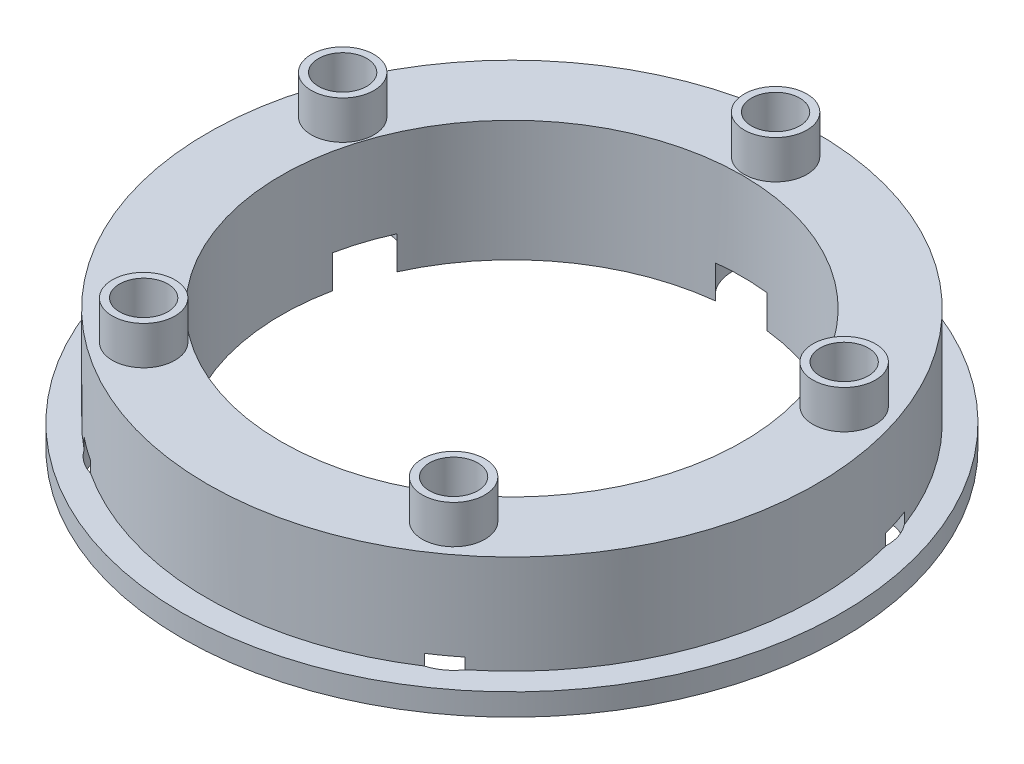
ISO-10303-21;
HEADER;
FILE_DESCRIPTION(('STEP AP214'),'2;1');
FILE_NAME('part.step','',(''),(''),'','','');
FILE_SCHEMA(('AUTOMOTIVE_DESIGN { 1 0 10303 214 1 1 1 1 }'));
ENDSEC;
DATA;
#1=APPLICATION_CONTEXT('core data for automotive mechanical design processes');
#2=APPLICATION_PROTOCOL_DEFINITION('international standard','automotive_design',2000,#1);
#3=PRODUCT_CONTEXT('',#1,'mechanical');
#4=PRODUCT('Part','Part','',(#3));
#5=PRODUCT_RELATED_PRODUCT_CATEGORY('part','',(#4));
#6=PRODUCT_DEFINITION_FORMATION('','',#4);
#7=PRODUCT_DEFINITION_CONTEXT('part definition',#1,'design');
#8=PRODUCT_DEFINITION('design','',#6,#7);
#9=PRODUCT_DEFINITION_SHAPE('','',#8);
#10=(LENGTH_UNIT() NAMED_UNIT(*) SI_UNIT(.MILLI.,.METRE.));
#11=(NAMED_UNIT(*) PLANE_ANGLE_UNIT() SI_UNIT($,.RADIAN.));
#12=(NAMED_UNIT(*) SI_UNIT($,.STERADIAN.) SOLID_ANGLE_UNIT());
#13=UNCERTAINTY_MEASURE_WITH_UNIT(LENGTH_MEASURE(1.E-05),#10,'distance_accuracy_value','');
#14=(GEOMETRIC_REPRESENTATION_CONTEXT(3) GLOBAL_UNCERTAINTY_ASSIGNED_CONTEXT((#13)) GLOBAL_UNIT_ASSIGNED_CONTEXT((#10,
#11,#12)) REPRESENTATION_CONTEXT('',''));
#15=CARTESIAN_POINT('',(0.,0.,0.));
#16=DIRECTION('',(0.,0.,1.));
#17=DIRECTION('',(1.,0.,0.));
#18=AXIS2_PLACEMENT_3D('',#15,#16,#17);
#19=CARTESIAN_POINT('',(-22.8253563910837,0.,-7.41640786499873));
#20=DIRECTION('',(0.,1.,0.));
#21=DIRECTION('',(0.,0.,1.));
#22=AXIS2_PLACEMENT_3D('',#19,#20,#21);
#23=CYLINDRICAL_SURFACE('',#22,2.2);
#24=CARTESIAN_POINT('',(-22.8253563910837,14.5,-7.41640786499873));
#25=DIRECTION('',(0.,1.,0.));
#26=DIRECTION('',(0.,0.,1.));
#27=AXIS2_PLACEMENT_3D('',#24,#25,#26);
#28=CIRCLE('',#27,2.20000000000001);
#29=CARTESIAN_POINT('',(-22.8253563910837,14.5,-5.21640786499873));
#30=VERTEX_POINT('',#29);
#31=EDGE_CURVE('E370',#30,#30,#28,.T.);
#32=ORIENTED_EDGE('',*,*,#31,.T.);
#33=EDGE_LOOP('',(#32));
#34=FACE_BOUND('',#33,.T.);
#35=CARTESIAN_POINT('',(-22.8253563910837,3.,-7.41640786499873));
#36=DIRECTION('',(0.,-1.,0.));
#37=DIRECTION('',(0.,0.,-1.));
#38=AXIS2_PLACEMENT_3D('',#35,#36,#37);
#39=CIRCLE('',#38,2.2);
#40=CARTESIAN_POINT('',(-22.8253563910837,3.,-9.61640786499874));
#41=VERTEX_POINT('',#40);
#42=EDGE_CURVE('E443',#41,#41,#39,.F.);
#43=ORIENTED_EDGE('',*,*,#42,.F.);
#44=EDGE_LOOP('',(#43));
#45=FACE_BOUND('',#44,.T.);
#46=ADVANCED_FACE('F37',(#34,#45),#23,.F.);
#47=CARTESIAN_POINT('',(-14.1068460550194,0.,19.4164078649987));
#48=DIRECTION('',(0.,1.,0.));
#49=DIRECTION('',(0.,0.,1.));
#50=AXIS2_PLACEMENT_3D('',#47,#48,#49);
#51=CYLINDRICAL_SURFACE('',#50,2.2);
#52=CARTESIAN_POINT('',(-14.1068460550194,14.5,19.4164078649985));
#53=DIRECTION('',(0.,1.,0.));
#54=DIRECTION('',(0.,0.,1.));
#55=AXIS2_PLACEMENT_3D('',#52,#53,#54);
#56=CIRCLE('',#55,2.2);
#57=CARTESIAN_POINT('',(-14.1068460550194,14.5,21.6164078649985));
#58=VERTEX_POINT('',#57);
#59=EDGE_CURVE('E339',#58,#58,#56,.T.);
#60=ORIENTED_EDGE('',*,*,#59,.T.);
#61=EDGE_LOOP('',(#60));
#62=FACE_BOUND('',#61,.T.);
#63=CARTESIAN_POINT('',(-14.1068460550194,3.,19.4164078649987));
#64=DIRECTION('',(0.,-1.,0.));
#65=DIRECTION('',(0.,0.,-1.));
#66=AXIS2_PLACEMENT_3D('',#63,#64,#65);
#67=CIRCLE('',#66,2.2);
#68=CARTESIAN_POINT('',(-14.1068460550194,3.,17.2164078649987));
#69=VERTEX_POINT('',#68);
#70=EDGE_CURVE('E469',#69,#69,#67,.F.);
#71=ORIENTED_EDGE('',*,*,#70,.F.);
#72=EDGE_LOOP('',(#71));
#73=FACE_BOUND('',#72,.T.);
#74=ADVANCED_FACE('F291',(#62,#73),#51,.F.);
#75=CARTESIAN_POINT('',(14.1068460550194,0.,19.4164078649987));
#76=DIRECTION('',(0.,1.,0.));
#77=DIRECTION('',(0.,0.,1.));
#78=AXIS2_PLACEMENT_3D('',#75,#76,#77);
#79=CYLINDRICAL_SURFACE('',#78,2.2);
#80=CARTESIAN_POINT('',(14.1068460550191,14.5,19.4164078649986));
#81=DIRECTION('',(0.,1.,0.));
#82=DIRECTION('',(0.,0.,1.));
#83=AXIS2_PLACEMENT_3D('',#80,#81,#82);
#84=CIRCLE('',#83,2.20000000000001);
#85=CARTESIAN_POINT('',(14.1068460550191,14.5,21.6164078649986));
#86=VERTEX_POINT('',#85);
#87=EDGE_CURVE('E351',#86,#86,#84,.T.);
#88=ORIENTED_EDGE('',*,*,#87,.T.);
#89=EDGE_LOOP('',(#88));
#90=FACE_BOUND('',#89,.T.);
#91=CARTESIAN_POINT('',(14.1068460550194,3.,19.4164078649987));
#92=DIRECTION('',(0.,-1.,0.));
#93=DIRECTION('',(0.,0.,-1.));
#94=AXIS2_PLACEMENT_3D('',#91,#92,#93);
#95=CIRCLE('',#94,2.2);
#96=CARTESIAN_POINT('',(14.1068460550194,3.,17.2164078649987));
#97=VERTEX_POINT('',#96);
#98=EDGE_CURVE('E400',#97,#97,#95,.F.);
#99=ORIENTED_EDGE('',*,*,#98,.F.);
#100=EDGE_LOOP('',(#99));
#101=FACE_BOUND('',#100,.T.);
#102=ADVANCED_FACE('F297',(#90,#101),#79,.F.);
#103=CARTESIAN_POINT('',(22.8253563910837,0.,-7.41640786499874));
#104=DIRECTION('',(0.,1.,0.));
#105=DIRECTION('',(0.,0.,1.));
#106=AXIS2_PLACEMENT_3D('',#103,#104,#105);
#107=CYLINDRICAL_SURFACE('',#106,2.2);
#108=CARTESIAN_POINT('',(22.8253563910833,14.5,-7.4164078649987));
#109=DIRECTION('',(0.,1.,0.));
#110=DIRECTION('',(0.,0.,1.));
#111=AXIS2_PLACEMENT_3D('',#108,#109,#110);
#112=CIRCLE('',#111,2.2);
#113=CARTESIAN_POINT('',(22.8253563910833,14.5,-5.2164078649987));
#114=VERTEX_POINT('',#113);
#115=EDGE_CURVE('E358',#114,#114,#112,.T.);
#116=ORIENTED_EDGE('',*,*,#115,.T.);
#117=EDGE_LOOP('',(#116));
#118=FACE_BOUND('',#117,.T.);
#119=CARTESIAN_POINT('',(22.8253563910837,3.,-7.41640786499874));
#120=DIRECTION('',(0.,-1.,0.));
#121=DIRECTION('',(0.,0.,-1.));
#122=AXIS2_PLACEMENT_3D('',#119,#120,#121);
#123=CIRCLE('',#122,2.2);
#124=CARTESIAN_POINT('',(22.8253563910837,3.,-9.61640786499874));
#125=VERTEX_POINT('',#124);
#126=EDGE_CURVE('E417',#125,#125,#123,.F.);
#127=ORIENTED_EDGE('',*,*,#126,.F.);
#128=EDGE_LOOP('',(#127));
#129=FACE_BOUND('',#128,.T.);
#130=ADVANCED_FACE('F312',(#118,#129),#107,.F.);
#131=CARTESIAN_POINT('',(0.,0.,-24.));
#132=DIRECTION('',(0.,1.,0.));
#133=DIRECTION('',(0.,0.,1.));
#134=AXIS2_PLACEMENT_3D('',#131,#132,#133);
#135=CYLINDRICAL_SURFACE('',#134,2.2);
#136=CARTESIAN_POINT('',(-1.56896379026443E-13,14.5,-23.9999999999999));
#137=DIRECTION('',(0.,1.,0.));
#138=DIRECTION('',(0.,0.,1.));
#139=AXIS2_PLACEMENT_3D('',#136,#137,#138);
#140=CIRCLE('',#139,2.2);
#141=CARTESIAN_POINT('',(-1.56896379026443E-13,14.5,-21.7999999999998));
#142=VERTEX_POINT('',#141);
#143=EDGE_CURVE('E365',#142,#142,#140,.T.);
#144=ORIENTED_EDGE('',*,*,#143,.T.);
#145=EDGE_LOOP('',(#144));
#146=FACE_BOUND('',#145,.T.);
#147=CARTESIAN_POINT('',(0.,3.,-24.));
#148=DIRECTION('',(0.,-1.,0.));
#149=DIRECTION('',(0.,0.,-1.));
#150=AXIS2_PLACEMENT_3D('',#147,#148,#149);
#151=CIRCLE('',#150,2.2);
#152=CARTESIAN_POINT('',(0.,3.,-26.2));
#153=VERTEX_POINT('',#152);
#154=EDGE_CURVE('E430',#153,#153,#151,.F.);
#155=ORIENTED_EDGE('',*,*,#154,.F.);
#156=EDGE_LOOP('',(#155));
#157=FACE_BOUND('',#156,.T.);
#158=ADVANCED_FACE('F305',(#146,#157),#135,.F.);
#159=CARTESIAN_POINT('',(0.,11.,0.));
#160=DIRECTION('',(0.,1.,0.));
#161=DIRECTION('',(0.,0.,1.));
#162=AXIS2_PLACEMENT_3D('',#159,#160,#161);
#163=PLANE('',#162);
#164=CARTESIAN_POINT('',(14.1068460550191,11.,19.4164078649986));
#165=DIRECTION('',(0.,1.,0.));
#166=DIRECTION('',(0.,0.,1.));
#167=AXIS2_PLACEMENT_3D('',#164,#165,#166);
#168=CIRCLE('',#167,2.84999999999978);
#169=CARTESIAN_POINT('',(14.1068460550191,11.,22.2664078649984));
#170=VERTEX_POINT('',#169);
#171=EDGE_CURVE('E318',#170,#170,#168,.T.);
#172=ORIENTED_EDGE('',*,*,#171,.F.);
#173=EDGE_LOOP('',(#172));
#174=FACE_BOUND('',#173,.T.);
#175=CARTESIAN_POINT('',(-1.56896379026443E-13,11.,-23.9999999999999));
#176=DIRECTION('',(0.,1.,0.));
#177=DIRECTION('',(0.,0.,1.));
#178=AXIS2_PLACEMENT_3D('',#175,#176,#177);
#179=CIRCLE('',#178,2.85);
#180=CARTESIAN_POINT('',(-1.56896379026443E-13,11.,-21.1499999999999));
#181=VERTEX_POINT('',#180);
#182=EDGE_CURVE('E322',#181,#181,#179,.T.);
#183=ORIENTED_EDGE('',*,*,#182,.F.);
#184=EDGE_LOOP('',(#183));
#185=FACE_BOUND('',#184,.T.);
#186=CARTESIAN_POINT('',(0.,11.,0.));
#187=DIRECTION('',(0.,1.,0.));
#188=DIRECTION('',(0.,0.,1.));
#189=AXIS2_PLACEMENT_3D('',#186,#187,#188);
#190=CIRCLE('',#189,27.7);
#191=CARTESIAN_POINT('',(0.,11.,27.7));
#192=VERTEX_POINT('',#191);
#193=EDGE_CURVE('E262',#192,#192,#190,.T.);
#194=ORIENTED_EDGE('',*,*,#193,.T.);
#195=EDGE_LOOP('',(#194));
#196=FACE_BOUND('',#195,.T.);
#197=CARTESIAN_POINT('',(0.,11.,0.));
#198=DIRECTION('',(0.,1.,0.));
#199=DIRECTION('',(0.,0.,1.));
#200=AXIS2_PLACEMENT_3D('',#197,#198,#199);
#201=CIRCLE('',#200,21.);
#202=CARTESIAN_POINT('',(0.,11.,21.));
#203=VERTEX_POINT('',#202);
#204=EDGE_CURVE('E209',#203,#203,#201,.T.);
#205=ORIENTED_EDGE('',*,*,#204,.F.);
#206=EDGE_LOOP('',(#205));
#207=FACE_BOUND('',#206,.T.);
#208=CARTESIAN_POINT('',(-22.8253563910837,11.,-7.41640786499873));
#209=DIRECTION('',(0.,1.,0.));
#210=DIRECTION('',(0.,0.,1.));
#211=AXIS2_PLACEMENT_3D('',#208,#209,#210);
#212=CIRCLE('',#211,2.85);
#213=CARTESIAN_POINT('',(-22.8253563910837,11.,-4.56640786499873));
#214=VERTEX_POINT('',#213);
#215=EDGE_CURVE('E330',#214,#214,#212,.T.);
#216=ORIENTED_EDGE('',*,*,#215,.F.);
#217=EDGE_LOOP('',(#216));
#218=FACE_BOUND('',#217,.T.);
#219=CARTESIAN_POINT('',(22.8253563910833,11.,-7.4164078649987));
#220=DIRECTION('',(0.,1.,0.));
#221=DIRECTION('',(0.,0.,1.));
#222=AXIS2_PLACEMENT_3D('',#219,#220,#221);
#223=CIRCLE('',#222,2.84999999999984);
#224=CARTESIAN_POINT('',(22.8253563910833,11.,-4.56640786499887));
#225=VERTEX_POINT('',#224);
#226=EDGE_CURVE('E334',#225,#225,#223,.T.);
#227=ORIENTED_EDGE('',*,*,#226,.F.);
#228=EDGE_LOOP('',(#227));
#229=FACE_BOUND('',#228,.T.);
#230=CARTESIAN_POINT('',(-14.1068460550194,11.,19.4164078649985));
#231=DIRECTION('',(0.,1.,0.));
#232=DIRECTION('',(0.,0.,1.));
#233=AXIS2_PLACEMENT_3D('',#230,#231,#232);
#234=CIRCLE('',#233,2.84999999999996);
#235=CARTESIAN_POINT('',(-14.1068460550194,11.,22.2664078649985));
#236=VERTEX_POINT('',#235);
#237=EDGE_CURVE('E337',#236,#236,#234,.T.);
#238=ORIENTED_EDGE('',*,*,#237,.F.);
#239=EDGE_LOOP('',(#238));
#240=FACE_BOUND('',#239,.T.);
#241=ADVANCED_FACE('F303',(#174,#185,#196,#207,#218,#229,#240),#163,.T.);
#242=CARTESIAN_POINT('',(0.,11.,0.));
#243=DIRECTION('',(0.,-1.,0.));
#244=DIRECTION('',(0.,0.,-1.));
#245=AXIS2_PLACEMENT_3D('',#242,#243,#244);
#246=CYLINDRICAL_SURFACE('',#245,27.7);
#247=CARTESIAN_POINT('',(0.,2.,0.));
#248=DIRECTION('',(0.,1.,0.));
#249=DIRECTION('',(0.,0.,1.));
#250=AXIS2_PLACEMENT_3D('',#247,#248,#249);
#251=CIRCLE('',#250,27.7);
#252=CARTESIAN_POINT('',(-1.32413388883302,2.,-27.6683333333333));
#253=VERTEX_POINT('',#252);
#254=CARTESIAN_POINT('',(-25.9049688372161,2.,-9.8093113694522));
#255=VERTEX_POINT('',#254);
#256=EDGE_CURVE('E457',#253,#255,#251,.T.);
#257=ORIENTED_EDGE('',*,*,#256,.T.);
#258=DIRECTION('',(0.,-1.,0.));
#259=VECTOR('',#258,1.);
#260=CARTESIAN_POINT('',(-25.9049688372161,1.5,-9.80931136945222));
#261=LINE('',#260,#259);
#262=CARTESIAN_POINT('',(-25.9049688372161,3.,-9.80931136945225));
#263=VERTEX_POINT('',#262);
#264=EDGE_CURVE('E60',#255,#263,#261,.F.);
#265=ORIENTED_EDGE('',*,*,#264,.T.);
#266=CARTESIAN_POINT('',(0.,3.,0.));
#267=DIRECTION('',(0.,-1.,0.));
#268=DIRECTION('',(0.,0.,-1.));
#269=AXIS2_PLACEMENT_3D('',#266,#267,#268);
#270=CIRCLE('',#269,27.7);
#271=CARTESIAN_POINT('',(-26.7233285861703,3.,-7.29065904260882));
#272=VERTEX_POINT('',#271);
#273=EDGE_CURVE('E446',#272,#263,#270,.T.);
#274=ORIENTED_EDGE('',*,*,#273,.F.);
#275=DIRECTION('',(0.,-1.,0.));
#276=VECTOR('',#275,1.);
#277=CARTESIAN_POINT('',(-26.7233285861703,1.5,-7.29065904260887));
#278=LINE('',#277,#276);
#279=CARTESIAN_POINT('',(-26.7233285861703,2.,-7.29065904260887));
#280=VERTEX_POINT('',#279);
#281=EDGE_CURVE('E449',#272,#280,#278,.T.);
#282=ORIENTED_EDGE('',*,*,#281,.T.);
#283=CARTESIAN_POINT('',(-17.3342851077391,2.,21.6058455007809));
#284=VERTEX_POINT('',#283);
#285=EDGE_CURVE('E266',#280,#284,#251,.T.);
#286=ORIENTED_EDGE('',*,*,#285,.T.);
#287=DIRECTION('',(0.,-1.,0.));
#288=VECTOR('',#287,1.);
#289=CARTESIAN_POINT('',(-17.3342851077391,1.5,21.6058455007809));
#290=LINE('',#289,#288);
#291=CARTESIAN_POINT('',(-17.3342851077391,3.,21.6058455007809));
#292=VERTEX_POINT('',#291);
#293=EDGE_CURVE('E52',#284,#292,#290,.F.);
#294=ORIENTED_EDGE('',*,*,#293,.T.);
#295=CARTESIAN_POINT('',(0.,3.,0.));
#296=DIRECTION('',(0.,-1.,0.));
#297=DIRECTION('',(0.,0.,-1.));
#298=AXIS2_PLACEMENT_3D('',#295,#296,#297);
#299=CIRCLE('',#298,27.7);
#300=CARTESIAN_POINT('',(-15.191791469952,3.,23.1624582446141));
#301=VERTEX_POINT('',#300);
#302=EDGE_CURVE('E467',#301,#292,#299,.T.);
#303=ORIENTED_EDGE('',*,*,#302,.F.);
#304=DIRECTION('',(0.,-1.,0.));
#305=VECTOR('',#304,1.);
#306=CARTESIAN_POINT('',(-15.191791469952,1.5,23.1624582446141));
#307=LINE('',#306,#305);
#308=CARTESIAN_POINT('',(-15.191791469952,2.,23.1624582446141));
#309=VERTEX_POINT('',#308);
#310=EDGE_CURVE('E406',#301,#309,#307,.T.);
#311=ORIENTED_EDGE('',*,*,#310,.T.);
#312=CARTESIAN_POINT('',(15.1917914699521,2.,23.1624582446141));
#313=VERTEX_POINT('',#312);
#314=EDGE_CURVE('E263',#309,#313,#251,.T.);
#315=ORIENTED_EDGE('',*,*,#314,.T.);
#316=DIRECTION('',(0.,-1.,0.));
#317=VECTOR('',#316,1.);
#318=CARTESIAN_POINT('',(15.1917914699521,1.5,23.1624582446141));
#319=LINE('',#318,#317);
#320=CARTESIAN_POINT('',(15.1917914699521,3.,23.1624582446141));
#321=VERTEX_POINT('',#320);
#322=EDGE_CURVE('E414',#313,#321,#319,.F.);
#323=ORIENTED_EDGE('',*,*,#322,.T.);
#324=CARTESIAN_POINT('',(0.,3.,0.));
#325=DIRECTION('',(0.,-1.,0.));
#326=DIRECTION('',(0.,0.,-1.));
#327=AXIS2_PLACEMENT_3D('',#324,#325,#326);
#328=CIRCLE('',#327,27.7);
#329=CARTESIAN_POINT('',(17.3342851077392,3.,21.6058455007808));
#330=VERTEX_POINT('',#329);
#331=EDGE_CURVE('E402',#330,#321,#328,.T.);
#332=ORIENTED_EDGE('',*,*,#331,.F.);
#333=DIRECTION('',(0.,-1.,0.));
#334=VECTOR('',#333,1.);
#335=CARTESIAN_POINT('',(17.3342851077392,1.5,21.6058455007808));
#336=LINE('',#335,#334);
#337=CARTESIAN_POINT('',(17.3342851077392,2.,21.6058455007808));
#338=VERTEX_POINT('',#337);
#339=EDGE_CURVE('E411',#330,#338,#336,.T.);
#340=ORIENTED_EDGE('',*,*,#339,.T.);
#341=CARTESIAN_POINT('',(26.7233285861702,2.,-7.29065904260925));
#342=VERTEX_POINT('',#341);
#343=EDGE_CURVE('E267',#338,#342,#251,.T.);
#344=ORIENTED_EDGE('',*,*,#343,.T.);
#345=DIRECTION('',(0.,-1.,0.));
#346=VECTOR('',#345,1.);
#347=CARTESIAN_POINT('',(26.7233285861702,1.5,-7.29065904260925));
#348=LINE('',#347,#346);
#349=CARTESIAN_POINT('',(26.7233285861702,3.,-7.29065904260924));
#350=VERTEX_POINT('',#349);
#351=EDGE_CURVE('E427',#342,#350,#348,.F.);
#352=ORIENTED_EDGE('',*,*,#351,.T.);
#353=CARTESIAN_POINT('',(0.,3.,0.));
#354=DIRECTION('',(0.,-1.,0.));
#355=DIRECTION('',(0.,0.,-1.));
#356=AXIS2_PLACEMENT_3D('',#353,#354,#355);
#357=CIRCLE('',#356,27.7);
#358=CARTESIAN_POINT('',(25.9049688372159,3.,-9.80931136945273));
#359=VERTEX_POINT('',#358);
#360=EDGE_CURVE('E420',#359,#350,#357,.T.);
#361=ORIENTED_EDGE('',*,*,#360,.F.);
#362=DIRECTION('',(0.,-1.,0.));
#363=VECTOR('',#362,1.);
#364=CARTESIAN_POINT('',(25.9049688372159,1.5,-9.80931136945272));
#365=LINE('',#364,#363);
#366=CARTESIAN_POINT('',(25.9049688372159,2.,-9.80931136945272));
#367=VERTEX_POINT('',#366);
#368=EDGE_CURVE('E424',#359,#367,#365,.T.);
#369=ORIENTED_EDGE('',*,*,#368,.T.);
#370=CARTESIAN_POINT('',(1.32413388883254,2.,-27.6683333333334));
#371=VERTEX_POINT('',#370);
#372=EDGE_CURVE('E460',#367,#371,#251,.T.);
#373=ORIENTED_EDGE('',*,*,#372,.T.);
#374=DIRECTION('',(0.,-1.,0.));
#375=VECTOR('',#374,1.);
#376=CARTESIAN_POINT('',(1.32413388883255,1.5,-27.6683333333334));
#377=LINE('',#376,#375);
#378=CARTESIAN_POINT('',(1.3241338888326,3.,-27.6683333333333));
#379=VERTEX_POINT('',#378);
#380=EDGE_CURVE('E440',#371,#379,#377,.F.);
#381=ORIENTED_EDGE('',*,*,#380,.T.);
#382=CARTESIAN_POINT('',(0.,3.,0.));
#383=DIRECTION('',(0.,-1.,0.));
#384=DIRECTION('',(0.,0.,-1.));
#385=AXIS2_PLACEMENT_3D('',#382,#383,#384);
#386=CIRCLE('',#385,27.7);
#387=CARTESIAN_POINT('',(-1.32413388883308,3.,-27.6683333333333));
#388=VERTEX_POINT('',#387);
#389=EDGE_CURVE('E433',#388,#379,#386,.T.);
#390=ORIENTED_EDGE('',*,*,#389,.F.);
#391=DIRECTION('',(0.,-1.,0.));
#392=VECTOR('',#391,1.);
#393=CARTESIAN_POINT('',(-1.32413388883303,1.5,-27.6683333333333));
#394=LINE('',#393,#392);
#395=EDGE_CURVE('E437',#388,#253,#394,.T.);
#396=ORIENTED_EDGE('',*,*,#395,.T.);
#397=EDGE_LOOP('',(#257,#265,#274,#282,#286,#294,#303,#311,#315,#323,#332,#340,#344,#352,#361,
#369,#373,#381,#390,#396));
#398=FACE_BOUND('',#397,.T.);
#399=ORIENTED_EDGE('',*,*,#193,.F.);
#400=EDGE_LOOP('',(#399));
#401=FACE_BOUND('',#400,.T.);
#402=ADVANCED_FACE('F39',(#398,#401),#246,.T.);
#403=CARTESIAN_POINT('',(0.,2.,0.));
#404=DIRECTION('',(0.,-1.,0.));
#405=DIRECTION('',(0.,0.,-1.));
#406=AXIS2_PLACEMENT_3D('',#403,#404,#405);
#407=CYLINDRICAL_SURFACE('',#406,30.);
#408=CARTESIAN_POINT('',(0.,2.,0.));
#409=DIRECTION('',(0.,1.,0.));
#410=DIRECTION('',(0.,0.,1.));
#411=AXIS2_PLACEMENT_3D('',#408,#409,#410);
#412=CIRCLE('',#411,30.);
#413=CARTESIAN_POINT('',(0.,2.,30.));
#414=VERTEX_POINT('',#413);
#415=EDGE_CURVE('E223',#414,#414,#412,.T.);
#416=ORIENTED_EDGE('',*,*,#415,.F.);
#417=EDGE_LOOP('',(#416));
#418=FACE_BOUND('',#417,.T.);
#419=CARTESIAN_POINT('',(0.,0.,0.));
#420=DIRECTION('',(0.,1.,0.));
#421=DIRECTION('',(0.,0.,1.));
#422=AXIS2_PLACEMENT_3D('',#419,#420,#421);
#423=CIRCLE('',#422,30.);
#424=CARTESIAN_POINT('',(0.,0.,30.));
#425=VERTEX_POINT('',#424);
#426=EDGE_CURVE('E218',#425,#425,#423,.T.);
#427=ORIENTED_EDGE('',*,*,#426,.T.);
#428=EDGE_LOOP('',(#427));
#429=FACE_BOUND('',#428,.T.);
#430=ADVANCED_FACE('F275',(#418,#429),#407,.T.);
#431=CARTESIAN_POINT('',(0.,2.,0.));
#432=DIRECTION('',(0.,1.,0.));
#433=DIRECTION('',(0.,0.,1.));
#434=AXIS2_PLACEMENT_3D('',#431,#432,#433);
#435=PLANE('',#434);
#436=CARTESIAN_POINT('',(-22.8253563910838,2.,-7.41640786499848));
#437=DIRECTION('',(0.,1.,0.));
#438=DIRECTION('',(0.,0.,1.));
#439=AXIS2_PLACEMENT_3D('',#436,#437,#438);
#440=CIRCLE('',#439,3.9);
#441=EDGE_CURVE('E448',#255,#280,#440,.T.);
#442=ORIENTED_EDGE('',*,*,#441,.F.);
#443=ORIENTED_EDGE('',*,*,#256,.F.);
#444=CARTESIAN_POINT('',(-2.08166817117217E-13,2.,-24.));
#445=DIRECTION('',(0.,1.,0.));
#446=DIRECTION('',(0.,0.,1.));
#447=AXIS2_PLACEMENT_3D('',#444,#445,#446);
#448=CIRCLE('',#447,3.9);
#449=EDGE_CURVE('E435',#371,#253,#448,.T.);
#450=ORIENTED_EDGE('',*,*,#449,.F.);
#451=ORIENTED_EDGE('',*,*,#372,.F.);
#452=CARTESIAN_POINT('',(22.8253563910837,2.,-7.41640786499887));
#453=DIRECTION('',(0.,1.,0.));
#454=DIRECTION('',(0.,0.,1.));
#455=AXIS2_PLACEMENT_3D('',#452,#453,#454);
#456=CIRCLE('',#455,3.9);
#457=EDGE_CURVE('E422',#342,#367,#456,.T.);
#458=ORIENTED_EDGE('',*,*,#457,.F.);
#459=ORIENTED_EDGE('',*,*,#343,.F.);
#460=CARTESIAN_POINT('',(14.1068460550194,2.,19.4164078649987));
#461=DIRECTION('',(0.,1.,0.));
#462=DIRECTION('',(0.,0.,1.));
#463=AXIS2_PLACEMENT_3D('',#460,#461,#462);
#464=CIRCLE('',#463,3.9);
#465=EDGE_CURVE('E404',#313,#338,#464,.T.);
#466=ORIENTED_EDGE('',*,*,#465,.F.);
#467=ORIENTED_EDGE('',*,*,#314,.F.);
#468=CARTESIAN_POINT('',(-14.1068460550194,2.,19.4164078649987));
#469=DIRECTION('',(0.,1.,0.));
#470=DIRECTION('',(0.,0.,1.));
#471=AXIS2_PLACEMENT_3D('',#468,#469,#470);
#472=CIRCLE('',#471,3.9);
#473=EDGE_CURVE('E464',#284,#309,#472,.T.);
#474=ORIENTED_EDGE('',*,*,#473,.F.);
#475=ORIENTED_EDGE('',*,*,#285,.F.);
#476=EDGE_LOOP('',(#442,#443,#450,#451,#458,#459,#466,#467,#474,#475));
#477=FACE_BOUND('',#476,.T.);
#478=ORIENTED_EDGE('',*,*,#415,.T.);
#479=EDGE_LOOP('',(#478));
#480=FACE_BOUND('',#479,.T.);
#481=ADVANCED_FACE('F273',(#477,#480),#435,.T.);
#482=CARTESIAN_POINT('',(0.,0.,0.));
#483=DIRECTION('',(0.,1.,0.));
#484=DIRECTION('',(0.,0.,1.));
#485=AXIS2_PLACEMENT_3D('',#482,#483,#484);
#486=PLANE('',#485);
#487=CARTESIAN_POINT('',(0.,0.,0.));
#488=DIRECTION('',(0.,1.,0.));
#489=DIRECTION('',(0.,0.,1.));
#490=AXIS2_PLACEMENT_3D('',#487,#488,#489);
#491=CIRCLE('',#490,21.);
#492=CARTESIAN_POINT('',(-2.32744755244364,0.,-20.870625));
#493=VERTEX_POINT('',#492);
#494=CARTESIAN_POINT('',(-19.1299230581812,0.,-8.66291196931297));
#495=VERTEX_POINT('',#494);
#496=EDGE_CURVE('E212',#493,#495,#491,.T.);
#497=ORIENTED_EDGE('',*,*,#496,.T.);
#498=CARTESIAN_POINT('',(-22.8253563910838,0.,-7.41640786499848));
#499=DIRECTION('',(0.,-1.,0.));
#500=DIRECTION('',(0.,0.,-1.));
#501=AXIS2_PLACEMENT_3D('',#498,#499,#500);
#502=CIRCLE('',#501,3.9);
#503=CARTESIAN_POINT('',(-20.568364752624,0.,-4.23584364713985));
#504=VERTEX_POINT('',#503);
#505=EDGE_CURVE('E229',#504,#495,#502,.T.);
#506=ORIENTED_EDGE('',*,*,#505,.F.);
#507=CARTESIAN_POINT('',(-14.1503902045697,0.,15.5166509614162));
#508=VERTEX_POINT('',#507);
#509=EDGE_CURVE('E199',#504,#508,#491,.T.);
#510=ORIENTED_EDGE('',*,*,#509,.T.);
#511=CARTESIAN_POINT('',(-14.1068460550194,0.,19.4164078649987));
#512=DIRECTION('',(0.,-1.,0.));
#513=DIRECTION('',(0.,0.,-1.));
#514=AXIS2_PLACEMENT_3D('',#511,#512,#513);
#515=CIRCLE('',#514,3.9);
#516=CARTESIAN_POINT('',(-10.3845009576835,0.,18.2527296550371));
#517=VERTEX_POINT('',#516);
#518=EDGE_CURVE('E179',#517,#508,#515,.T.);
#519=ORIENTED_EDGE('',*,*,#518,.F.);
#520=CARTESIAN_POINT('',(10.3845009576835,0.,18.2527296550371));
#521=VERTEX_POINT('',#520);
#522=EDGE_CURVE('E196',#517,#521,#491,.T.);
#523=ORIENTED_EDGE('',*,*,#522,.T.);
#524=CARTESIAN_POINT('',(14.1068460550194,0.,19.4164078649987));
#525=DIRECTION('',(0.,-1.,0.));
#526=DIRECTION('',(0.,0.,-1.));
#527=AXIS2_PLACEMENT_3D('',#524,#525,#526);
#528=CIRCLE('',#527,3.9);
#529=CARTESIAN_POINT('',(14.1503902045698,0.,15.5166509614161));
#530=VERTEX_POINT('',#529);
#531=EDGE_CURVE('E201',#530,#521,#528,.T.);
#532=ORIENTED_EDGE('',*,*,#531,.F.);
#533=CARTESIAN_POINT('',(20.5683647526239,0.,-4.23584364714022));
#534=VERTEX_POINT('',#533);
#535=EDGE_CURVE('E211',#530,#534,#491,.T.);
#536=ORIENTED_EDGE('',*,*,#535,.T.);
#537=CARTESIAN_POINT('',(22.8253563910837,0.,-7.41640786499887));
#538=DIRECTION('',(0.,-1.,0.));
#539=DIRECTION('',(0.,0.,-1.));
#540=AXIS2_PLACEMENT_3D('',#537,#538,#539);
#541=CIRCLE('',#540,3.9);
#542=CARTESIAN_POINT('',(19.1299230581811,0.,-8.66291196931328));
#543=VERTEX_POINT('',#542);
#544=EDGE_CURVE('E487',#543,#534,#541,.T.);
#545=ORIENTED_EDGE('',*,*,#544,.F.);
#546=CARTESIAN_POINT('',(2.32744755244327,0.,-20.870625));
#547=VERTEX_POINT('',#546);
#548=EDGE_CURVE('E219',#543,#547,#491,.T.);
#549=ORIENTED_EDGE('',*,*,#548,.T.);
#550=CARTESIAN_POINT('',(-2.08166817117217E-13,0.,-24.));
#551=DIRECTION('',(0.,-1.,0.));
#552=DIRECTION('',(0.,0.,-1.));
#553=AXIS2_PLACEMENT_3D('',#550,#551,#552);
#554=CIRCLE('',#553,3.9);
#555=EDGE_CURVE('E230',#493,#547,#554,.T.);
#556=ORIENTED_EDGE('',*,*,#555,.F.);
#557=EDGE_LOOP('',(#497,#506,#510,#519,#523,#532,#536,#545,#549,#556));
#558=FACE_BOUND('',#557,.T.);
#559=ORIENTED_EDGE('',*,*,#426,.F.);
#560=EDGE_LOOP('',(#559));
#561=FACE_BOUND('',#560,.T.);
#562=ADVANCED_FACE('F193',(#558,#561),#486,.F.);
#563=CARTESIAN_POINT('',(0.,0.,0.));
#564=DIRECTION('',(0.,1.,0.));
#565=DIRECTION('',(0.,0.,1.));
#566=AXIS2_PLACEMENT_3D('',#563,#564,#565);
#567=CYLINDRICAL_SURFACE('',#566,21.);
#568=ORIENTED_EDGE('',*,*,#509,.F.);
#569=DIRECTION('',(0.,-1.,0.));
#570=VECTOR('',#569,1.);
#571=CARTESIAN_POINT('',(-20.568364752624,1.5,-4.23584364713987));
#572=LINE('',#571,#570);
#573=CARTESIAN_POINT('',(-20.568364752624,3.,-4.23584364713985));
#574=VERTEX_POINT('',#573);
#575=EDGE_CURVE('E11',#504,#574,#572,.F.);
#576=ORIENTED_EDGE('',*,*,#575,.T.);
#577=CARTESIAN_POINT('',(0.,3.,0.));
#578=DIRECTION('',(0.,-1.,0.));
#579=DIRECTION('',(0.,0.,-1.));
#580=AXIS2_PLACEMENT_3D('',#577,#578,#579);
#581=CIRCLE('',#580,21.);
#582=CARTESIAN_POINT('',(-19.1299230581812,3.,-8.66291196931297));
#583=VERTEX_POINT('',#582);
#584=EDGE_CURVE('E237',#583,#574,#581,.F.);
#585=ORIENTED_EDGE('',*,*,#584,.F.);
#586=DIRECTION('',(0.,-1.,0.));
#587=VECTOR('',#586,1.);
#588=CARTESIAN_POINT('',(-19.1299230581812,1.5,-8.66291196931295));
#589=LINE('',#588,#587);
#590=EDGE_CURVE('E45',#583,#495,#589,.T.);
#591=ORIENTED_EDGE('',*,*,#590,.T.);
#592=ORIENTED_EDGE('',*,*,#496,.F.);
#593=DIRECTION('',(0.,-1.,0.));
#594=VECTOR('',#593,1.);
#595=CARTESIAN_POINT('',(-2.32744755244362,1.5,-20.870625));
#596=LINE('',#595,#594);
#597=CARTESIAN_POINT('',(-2.32744755244364,3.,-20.870625));
#598=VERTEX_POINT('',#597);
#599=EDGE_CURVE('E234',#493,#598,#596,.F.);
#600=ORIENTED_EDGE('',*,*,#599,.T.);
#601=CARTESIAN_POINT('',(0.,3.,0.));
#602=DIRECTION('',(0.,-1.,0.));
#603=DIRECTION('',(0.,0.,-1.));
#604=AXIS2_PLACEMENT_3D('',#601,#602,#603);
#605=CIRCLE('',#604,21.);
#606=CARTESIAN_POINT('',(2.32744755244327,3.,-20.870625));
#607=VERTEX_POINT('',#606);
#608=EDGE_CURVE('E244',#607,#598,#605,.F.);
#609=ORIENTED_EDGE('',*,*,#608,.F.);
#610=DIRECTION('',(0.,-1.,0.));
#611=VECTOR('',#610,1.);
#612=CARTESIAN_POINT('',(2.32744755244325,1.5,-20.870625));
#613=LINE('',#612,#611);
#614=EDGE_CURVE('E241',#607,#547,#613,.T.);
#615=ORIENTED_EDGE('',*,*,#614,.T.);
#616=ORIENTED_EDGE('',*,*,#548,.F.);
#617=DIRECTION('',(0.,-1.,0.));
#618=VECTOR('',#617,1.);
#619=CARTESIAN_POINT('',(19.1299230581811,1.5,-8.66291196931327));
#620=LINE('',#619,#618);
#621=CARTESIAN_POINT('',(19.1299230581811,3.,-8.66291196931328));
#622=VERTEX_POINT('',#621);
#623=EDGE_CURVE('E246',#543,#622,#620,.F.);
#624=ORIENTED_EDGE('',*,*,#623,.T.);
#625=CARTESIAN_POINT('',(0.,3.,0.));
#626=DIRECTION('',(0.,-1.,0.));
#627=DIRECTION('',(0.,0.,-1.));
#628=AXIS2_PLACEMENT_3D('',#625,#626,#627);
#629=CIRCLE('',#628,21.);
#630=CARTESIAN_POINT('',(20.5683647526239,3.,-4.23584364714022));
#631=VERTEX_POINT('',#630);
#632=EDGE_CURVE('E252',#631,#622,#629,.F.);
#633=ORIENTED_EDGE('',*,*,#632,.F.);
#634=DIRECTION('',(0.,-1.,0.));
#635=VECTOR('',#634,1.);
#636=CARTESIAN_POINT('',(20.5683647526239,1.5,-4.23584364714022));
#637=LINE('',#636,#635);
#638=EDGE_CURVE('E249',#631,#534,#637,.T.);
#639=ORIENTED_EDGE('',*,*,#638,.T.);
#640=ORIENTED_EDGE('',*,*,#535,.F.);
#641=DIRECTION('',(0.,-1.,0.));
#642=VECTOR('',#641,1.);
#643=CARTESIAN_POINT('',(14.1503902045697,1.5,15.5166509614161));
#644=LINE('',#643,#642);
#645=CARTESIAN_POINT('',(14.1503902045698,3.,15.5166509614161));
#646=VERTEX_POINT('',#645);
#647=EDGE_CURVE('E254',#530,#646,#644,.F.);
#648=ORIENTED_EDGE('',*,*,#647,.T.);
#649=CARTESIAN_POINT('',(0.,3.,0.));
#650=DIRECTION('',(0.,-1.,0.));
#651=DIRECTION('',(0.,0.,-1.));
#652=AXIS2_PLACEMENT_3D('',#649,#650,#651);
#653=CIRCLE('',#652,21.);
#654=CARTESIAN_POINT('',(10.3845009576835,3.,18.2527296550371));
#655=VERTEX_POINT('',#654);
#656=EDGE_CURVE('E186',#655,#646,#653,.F.);
#657=ORIENTED_EDGE('',*,*,#656,.F.);
#658=DIRECTION('',(0.,-1.,0.));
#659=VECTOR('',#658,1.);
#660=CARTESIAN_POINT('',(10.3845009576835,1.5,18.2527296550371));
#661=LINE('',#660,#659);
#662=EDGE_CURVE('E208',#655,#521,#661,.T.);
#663=ORIENTED_EDGE('',*,*,#662,.T.);
#664=ORIENTED_EDGE('',*,*,#522,.F.);
#665=DIRECTION('',(0.,-1.,0.));
#666=VECTOR('',#665,1.);
#667=CARTESIAN_POINT('',(-10.3845009576835,1.5,18.2527296550371));
#668=LINE('',#667,#666);
#669=CARTESIAN_POINT('',(-10.3845009576835,3.,18.2527296550371));
#670=VERTEX_POINT('',#669);
#671=EDGE_CURVE('E175',#517,#670,#668,.F.);
#672=ORIENTED_EDGE('',*,*,#671,.T.);
#673=CARTESIAN_POINT('',(0.,3.,0.));
#674=DIRECTION('',(0.,-1.,0.));
#675=DIRECTION('',(0.,0.,-1.));
#676=AXIS2_PLACEMENT_3D('',#673,#674,#675);
#677=CIRCLE('',#676,21.);
#678=CARTESIAN_POINT('',(-14.1503902045697,3.,15.5166509614162));
#679=VERTEX_POINT('',#678);
#680=EDGE_CURVE('E260',#679,#670,#677,.F.);
#681=ORIENTED_EDGE('',*,*,#680,.F.);
#682=DIRECTION('',(0.,-1.,0.));
#683=VECTOR('',#682,1.);
#684=CARTESIAN_POINT('',(-14.1503902045697,1.5,15.5166509614162));
#685=LINE('',#684,#683);
#686=EDGE_CURVE('E187',#679,#508,#685,.T.);
#687=ORIENTED_EDGE('',*,*,#686,.T.);
#688=EDGE_LOOP('',(#568,#576,#585,#591,#592,#600,#609,#615,#616,#624,#633,#639,#640,#648,#657,
#663,#664,#672,#681,#687));
#689=FACE_BOUND('',#688,.T.);
#690=ORIENTED_EDGE('',*,*,#204,.T.);
#691=EDGE_LOOP('',(#690));
#692=FACE_BOUND('',#691,.T.);
#693=ADVANCED_FACE('F204',(#689,#692),#567,.F.);
#694=CARTESIAN_POINT('',(-22.8253563910837,14.5,-7.41640786499873));
#695=DIRECTION('',(0.,1.,0.));
#696=DIRECTION('',(0.,0.,1.));
#697=AXIS2_PLACEMENT_3D('',#694,#695,#696);
#698=PLANE('',#697);
#699=CARTESIAN_POINT('',(-22.8253563910837,14.5,-7.41640786499873));
#700=DIRECTION('',(0.,1.,0.));
#701=DIRECTION('',(0.,0.,1.));
#702=AXIS2_PLACEMENT_3D('',#699,#700,#701);
#703=CIRCLE('',#702,2.85);
#704=CARTESIAN_POINT('',(-22.8253563910837,14.5,-4.56640786499873));
#705=VERTEX_POINT('',#704);
#706=EDGE_CURVE('E214',#705,#705,#703,.T.);
#707=ORIENTED_EDGE('',*,*,#706,.T.);
#708=EDGE_LOOP('',(#707));
#709=FACE_BOUND('',#708,.T.);
#710=ORIENTED_EDGE('',*,*,#31,.F.);
#711=EDGE_LOOP('',(#710));
#712=FACE_BOUND('',#711,.T.);
#713=ADVANCED_FACE('F285',(#709,#712),#698,.T.);
#714=CARTESIAN_POINT('',(-22.8253563910837,14.5,-7.41640786499873));
#715=DIRECTION('',(0.,-1.,0.));
#716=DIRECTION('',(0.,0.,-1.));
#717=AXIS2_PLACEMENT_3D('',#714,#715,#716);
#718=CYLINDRICAL_SURFACE('',#717,2.85);
#719=ORIENTED_EDGE('',*,*,#706,.F.);
#720=EDGE_LOOP('',(#719));
#721=FACE_BOUND('',#720,.T.);
#722=ORIENTED_EDGE('',*,*,#215,.T.);
#723=EDGE_LOOP('',(#722));
#724=FACE_BOUND('',#723,.T.);
#725=ADVANCED_FACE('F374',(#721,#724),#718,.T.);
#726=CARTESIAN_POINT('',(-1.56896379026443E-13,14.5,-23.9999999999999));
#727=DIRECTION('',(0.,1.,0.));
#728=DIRECTION('',(0.,0.,1.));
#729=AXIS2_PLACEMENT_3D('',#726,#727,#728);
#730=PLANE('',#729);
#731=CARTESIAN_POINT('',(-1.56896379026443E-13,14.5,-23.9999999999999));
#732=DIRECTION('',(0.,1.,0.));
#733=DIRECTION('',(0.,0.,1.));
#734=AXIS2_PLACEMENT_3D('',#731,#732,#733);
#735=CIRCLE('',#734,2.85);
#736=CARTESIAN_POINT('',(-1.56896379026443E-13,14.5,-21.1499999999999));
#737=VERTEX_POINT('',#736);
#738=EDGE_CURVE('E363',#737,#737,#735,.T.);
#739=ORIENTED_EDGE('',*,*,#738,.T.);
#740=EDGE_LOOP('',(#739));
#741=FACE_BOUND('',#740,.T.);
#742=ORIENTED_EDGE('',*,*,#143,.F.);
#743=EDGE_LOOP('',(#742));
#744=FACE_BOUND('',#743,.T.);
#745=ADVANCED_FACE('F376',(#741,#744),#730,.T.);
#746=CARTESIAN_POINT('',(-1.56896379026443E-13,14.5,-23.9999999999999));
#747=DIRECTION('',(0.,-1.,0.));
#748=DIRECTION('',(0.,0.,-1.));
#749=AXIS2_PLACEMENT_3D('',#746,#747,#748);
#750=CYLINDRICAL_SURFACE('',#749,2.85);
#751=ORIENTED_EDGE('',*,*,#738,.F.);
#752=EDGE_LOOP('',(#751));
#753=FACE_BOUND('',#752,.T.);
#754=ORIENTED_EDGE('',*,*,#182,.T.);
#755=EDGE_LOOP('',(#754));
#756=FACE_BOUND('',#755,.T.);
#757=ADVANCED_FACE('F383',(#753,#756),#750,.T.);
#758=CARTESIAN_POINT('',(22.8253563910833,14.5,-7.4164078649987));
#759=DIRECTION('',(0.,1.,0.));
#760=DIRECTION('',(0.,0.,1.));
#761=AXIS2_PLACEMENT_3D('',#758,#759,#760);
#762=PLANE('',#761);
#763=CARTESIAN_POINT('',(22.8253563910833,14.5,-7.4164078649987));
#764=DIRECTION('',(0.,1.,0.));
#765=DIRECTION('',(0.,0.,1.));
#766=AXIS2_PLACEMENT_3D('',#763,#764,#765);
#767=CIRCLE('',#766,2.84999999999984);
#768=CARTESIAN_POINT('',(22.8253563910833,14.5,-4.56640786499887));
#769=VERTEX_POINT('',#768);
#770=EDGE_CURVE('E356',#769,#769,#767,.T.);
#771=ORIENTED_EDGE('',*,*,#770,.T.);
#772=EDGE_LOOP('',(#771));
#773=FACE_BOUND('',#772,.T.);
#774=ORIENTED_EDGE('',*,*,#115,.F.);
#775=EDGE_LOOP('',(#774));
#776=FACE_BOUND('',#775,.T.);
#777=ADVANCED_FACE('F559',(#773,#776),#762,.T.);
#778=CARTESIAN_POINT('',(22.8253563910833,14.5,-7.4164078649987));
#779=DIRECTION('',(0.,-1.,0.));
#780=DIRECTION('',(0.,0.,-1.));
#781=AXIS2_PLACEMENT_3D('',#778,#779,#780);
#782=CYLINDRICAL_SURFACE('',#781,2.84999999999984);
#783=ORIENTED_EDGE('',*,*,#770,.F.);
#784=EDGE_LOOP('',(#783));
#785=FACE_BOUND('',#784,.T.);
#786=ORIENTED_EDGE('',*,*,#226,.T.);
#787=EDGE_LOOP('',(#786));
#788=FACE_BOUND('',#787,.T.);
#789=ADVANCED_FACE('F555',(#785,#788),#782,.T.);
#790=CARTESIAN_POINT('',(14.1068460550191,14.5,19.4164078649986));
#791=DIRECTION('',(0.,1.,0.));
#792=DIRECTION('',(0.,0.,1.));
#793=AXIS2_PLACEMENT_3D('',#790,#791,#792);
#794=PLANE('',#793);
#795=CARTESIAN_POINT('',(14.1068460550191,14.5,19.4164078649986));
#796=DIRECTION('',(0.,1.,0.));
#797=DIRECTION('',(0.,0.,1.));
#798=AXIS2_PLACEMENT_3D('',#795,#796,#797);
#799=CIRCLE('',#798,2.84999999999978);
#800=CARTESIAN_POINT('',(14.1068460550191,14.5,22.2664078649984));
#801=VERTEX_POINT('',#800);
#802=EDGE_CURVE('E343',#801,#801,#799,.T.);
#803=ORIENTED_EDGE('',*,*,#802,.T.);
#804=EDGE_LOOP('',(#803));
#805=FACE_BOUND('',#804,.T.);
#806=ORIENTED_EDGE('',*,*,#87,.F.);
#807=EDGE_LOOP('',(#806));
#808=FACE_BOUND('',#807,.T.);
#809=ADVANCED_FACE('F551',(#805,#808),#794,.T.);
#810=CARTESIAN_POINT('',(14.1068460550191,14.5,19.4164078649986));
#811=DIRECTION('',(0.,-1.,0.));
#812=DIRECTION('',(0.,0.,-1.));
#813=AXIS2_PLACEMENT_3D('',#810,#811,#812);
#814=CYLINDRICAL_SURFACE('',#813,2.84999999999978);
#815=ORIENTED_EDGE('',*,*,#802,.F.);
#816=EDGE_LOOP('',(#815));
#817=FACE_BOUND('',#816,.T.);
#818=ORIENTED_EDGE('',*,*,#171,.T.);
#819=EDGE_LOOP('',(#818));
#820=FACE_BOUND('',#819,.T.);
#821=ADVANCED_FACE('F547',(#817,#820),#814,.T.);
#822=CARTESIAN_POINT('',(-14.1068460550194,14.5,19.4164078649985));
#823=DIRECTION('',(0.,1.,0.));
#824=DIRECTION('',(0.,0.,1.));
#825=AXIS2_PLACEMENT_3D('',#822,#823,#824);
#826=PLANE('',#825);
#827=CARTESIAN_POINT('',(-14.1068460550194,14.5,19.4164078649985));
#828=DIRECTION('',(0.,1.,0.));
#829=DIRECTION('',(0.,0.,1.));
#830=AXIS2_PLACEMENT_3D('',#827,#828,#829);
#831=CIRCLE('',#830,2.84999999999996);
#832=CARTESIAN_POINT('',(-14.1068460550194,14.5,22.2664078649985));
#833=VERTEX_POINT('',#832);
#834=EDGE_CURVE('E340',#833,#833,#831,.T.);
#835=ORIENTED_EDGE('',*,*,#834,.T.);
#836=EDGE_LOOP('',(#835));
#837=FACE_BOUND('',#836,.T.);
#838=ORIENTED_EDGE('',*,*,#59,.F.);
#839=EDGE_LOOP('',(#838));
#840=FACE_BOUND('',#839,.T.);
#841=ADVANCED_FACE('F543',(#837,#840),#826,.T.);
#842=CARTESIAN_POINT('',(-14.1068460550194,14.5,19.4164078649985));
#843=DIRECTION('',(0.,-1.,0.));
#844=DIRECTION('',(0.,0.,-1.));
#845=AXIS2_PLACEMENT_3D('',#842,#843,#844);
#846=CYLINDRICAL_SURFACE('',#845,2.84999999999996);
#847=ORIENTED_EDGE('',*,*,#834,.F.);
#848=EDGE_LOOP('',(#847));
#849=FACE_BOUND('',#848,.T.);
#850=ORIENTED_EDGE('',*,*,#237,.T.);
#851=EDGE_LOOP('',(#850));
#852=FACE_BOUND('',#851,.T.);
#853=ADVANCED_FACE('F540',(#849,#852),#846,.T.);
#854=CARTESIAN_POINT('',(-14.1068460550194,3.,19.4164078649987));
#855=DIRECTION('',(0.,-1.,0.));
#856=DIRECTION('',(0.,0.,-1.));
#857=AXIS2_PLACEMENT_3D('',#854,#855,#856);
#858=CYLINDRICAL_SURFACE('',#857,3.9);
#859=ORIENTED_EDGE('',*,*,#473,.T.);
#860=ORIENTED_EDGE('',*,*,#310,.F.);
#861=CARTESIAN_POINT('',(-14.1068460550194,3.,19.4164078649987));
#862=DIRECTION('',(0.,-1.,0.));
#863=DIRECTION('',(0.,0.,-1.));
#864=AXIS2_PLACEMENT_3D('',#861,#862,#863);
#865=CIRCLE('',#864,3.9);
#866=EDGE_CURVE('E182',#670,#301,#865,.T.);
#867=ORIENTED_EDGE('',*,*,#866,.F.);
#868=ORIENTED_EDGE('',*,*,#671,.F.);
#869=ORIENTED_EDGE('',*,*,#518,.T.);
#870=ORIENTED_EDGE('',*,*,#686,.F.);
#871=EDGE_CURVE('E200',#292,#679,#865,.T.);
#872=ORIENTED_EDGE('',*,*,#871,.F.);
#873=ORIENTED_EDGE('',*,*,#293,.F.);
#874=EDGE_LOOP('',(#859,#860,#867,#868,#869,#870,#872,#873));
#875=FACE_BOUND('',#874,.T.);
#876=ADVANCED_FACE('F177',(#875),#858,.F.);
#877=CARTESIAN_POINT('',(-14.1068460550194,3.,19.4164078649987));
#878=DIRECTION('',(0.,-1.,0.));
#879=DIRECTION('',(0.,0.,-1.));
#880=AXIS2_PLACEMENT_3D('',#877,#878,#879);
#881=PLANE('',#880);
#882=ORIENTED_EDGE('',*,*,#70,.T.);
#883=EDGE_LOOP('',(#882));
#884=FACE_BOUND('',#883,.T.);
#885=ORIENTED_EDGE('',*,*,#302,.T.);
#886=ORIENTED_EDGE('',*,*,#871,.T.);
#887=ORIENTED_EDGE('',*,*,#680,.T.);
#888=ORIENTED_EDGE('',*,*,#866,.T.);
#889=EDGE_LOOP('',(#885,#886,#887,#888));
#890=FACE_BOUND('',#889,.T.);
#891=ADVANCED_FACE('F520',(#884,#890),#881,.T.);
#892=CARTESIAN_POINT('',(14.1068460550194,3.,19.4164078649987));
#893=DIRECTION('',(0.,-1.,0.));
#894=DIRECTION('',(0.,0.,-1.));
#895=AXIS2_PLACEMENT_3D('',#892,#893,#894);
#896=CYLINDRICAL_SURFACE('',#895,3.9);
#897=ORIENTED_EDGE('',*,*,#465,.T.);
#898=ORIENTED_EDGE('',*,*,#339,.F.);
#899=CARTESIAN_POINT('',(14.1068460550194,3.,19.4164078649987));
#900=DIRECTION('',(0.,-1.,0.));
#901=DIRECTION('',(0.,0.,-1.));
#902=AXIS2_PLACEMENT_3D('',#899,#900,#901);
#903=CIRCLE('',#902,3.9);
#904=EDGE_CURVE('E490',#646,#330,#903,.T.);
#905=ORIENTED_EDGE('',*,*,#904,.F.);
#906=ORIENTED_EDGE('',*,*,#647,.F.);
#907=ORIENTED_EDGE('',*,*,#531,.T.);
#908=ORIENTED_EDGE('',*,*,#662,.F.);
#909=EDGE_CURVE('E489',#321,#655,#903,.T.);
#910=ORIENTED_EDGE('',*,*,#909,.F.);
#911=ORIENTED_EDGE('',*,*,#322,.F.);
#912=EDGE_LOOP('',(#897,#898,#905,#906,#907,#908,#910,#911));
#913=FACE_BOUND('',#912,.T.);
#914=ADVANCED_FACE('F494',(#913),#896,.F.);
#915=CARTESIAN_POINT('',(14.1068460550194,3.,19.4164078649987));
#916=DIRECTION('',(0.,-1.,0.));
#917=DIRECTION('',(0.,0.,-1.));
#918=AXIS2_PLACEMENT_3D('',#915,#916,#917);
#919=PLANE('',#918);
#920=ORIENTED_EDGE('',*,*,#98,.T.);
#921=EDGE_LOOP('',(#920));
#922=FACE_BOUND('',#921,.T.);
#923=ORIENTED_EDGE('',*,*,#331,.T.);
#924=ORIENTED_EDGE('',*,*,#909,.T.);
#925=ORIENTED_EDGE('',*,*,#656,.T.);
#926=ORIENTED_EDGE('',*,*,#904,.T.);
#927=EDGE_LOOP('',(#923,#924,#925,#926));
#928=FACE_BOUND('',#927,.T.);
#929=ADVANCED_FACE('F518',(#922,#928),#919,.T.);
#930=CARTESIAN_POINT('',(22.8253563910837,3.,-7.41640786499887));
#931=DIRECTION('',(0.,-1.,0.));
#932=DIRECTION('',(0.,0.,-1.));
#933=AXIS2_PLACEMENT_3D('',#930,#931,#932);
#934=CYLINDRICAL_SURFACE('',#933,3.9);
#935=ORIENTED_EDGE('',*,*,#457,.T.);
#936=ORIENTED_EDGE('',*,*,#368,.F.);
#937=CARTESIAN_POINT('',(22.8253563910837,3.,-7.41640786499887));
#938=DIRECTION('',(0.,-1.,0.));
#939=DIRECTION('',(0.,0.,-1.));
#940=AXIS2_PLACEMENT_3D('',#937,#938,#939);
#941=CIRCLE('',#940,3.9);
#942=EDGE_CURVE('E483',#622,#359,#941,.T.);
#943=ORIENTED_EDGE('',*,*,#942,.F.);
#944=ORIENTED_EDGE('',*,*,#623,.F.);
#945=ORIENTED_EDGE('',*,*,#544,.T.);
#946=ORIENTED_EDGE('',*,*,#638,.F.);
#947=EDGE_CURVE('E486',#350,#631,#941,.T.);
#948=ORIENTED_EDGE('',*,*,#947,.F.);
#949=ORIENTED_EDGE('',*,*,#351,.F.);
#950=EDGE_LOOP('',(#935,#936,#943,#944,#945,#946,#948,#949));
#951=FACE_BOUND('',#950,.T.);
#952=ADVANCED_FACE('F501',(#951),#934,.F.);
#953=CARTESIAN_POINT('',(22.8253563910837,3.,-7.41640786499887));
#954=DIRECTION('',(0.,-1.,0.));
#955=DIRECTION('',(0.,0.,-1.));
#956=AXIS2_PLACEMENT_3D('',#953,#954,#955);
#957=PLANE('',#956);
#958=ORIENTED_EDGE('',*,*,#126,.T.);
#959=EDGE_LOOP('',(#958));
#960=FACE_BOUND('',#959,.T.);
#961=ORIENTED_EDGE('',*,*,#360,.T.);
#962=ORIENTED_EDGE('',*,*,#947,.T.);
#963=ORIENTED_EDGE('',*,*,#632,.T.);
#964=ORIENTED_EDGE('',*,*,#942,.T.);
#965=EDGE_LOOP('',(#961,#962,#963,#964));
#966=FACE_BOUND('',#965,.T.);
#967=ADVANCED_FACE('F579',(#960,#966),#957,.T.);
#968=CARTESIAN_POINT('',(-2.08166817117217E-13,3.,-24.));
#969=DIRECTION('',(0.,-1.,0.));
#970=DIRECTION('',(0.,0.,-1.));
#971=AXIS2_PLACEMENT_3D('',#968,#969,#970);
#972=CYLINDRICAL_SURFACE('',#971,3.9);
#973=ORIENTED_EDGE('',*,*,#449,.T.);
#974=ORIENTED_EDGE('',*,*,#395,.F.);
#975=CARTESIAN_POINT('',(-2.08166817117217E-13,3.,-24.));
#976=DIRECTION('',(0.,-1.,0.));
#977=DIRECTION('',(0.,0.,-1.));
#978=AXIS2_PLACEMENT_3D('',#975,#976,#977);
#979=CIRCLE('',#978,3.9);
#980=EDGE_CURVE('E479',#598,#388,#979,.T.);
#981=ORIENTED_EDGE('',*,*,#980,.F.);
#982=ORIENTED_EDGE('',*,*,#599,.F.);
#983=ORIENTED_EDGE('',*,*,#555,.T.);
#984=ORIENTED_EDGE('',*,*,#614,.F.);
#985=EDGE_CURVE('E480',#379,#607,#979,.T.);
#986=ORIENTED_EDGE('',*,*,#985,.F.);
#987=ORIENTED_EDGE('',*,*,#380,.F.);
#988=EDGE_LOOP('',(#973,#974,#981,#982,#983,#984,#986,#987));
#989=FACE_BOUND('',#988,.T.);
#990=ADVANCED_FACE('F506',(#989),#972,.F.);
#991=CARTESIAN_POINT('',(-2.08166817117217E-13,3.,-24.));
#992=DIRECTION('',(0.,-1.,0.));
#993=DIRECTION('',(0.,0.,-1.));
#994=AXIS2_PLACEMENT_3D('',#991,#992,#993);
#995=PLANE('',#994);
#996=ORIENTED_EDGE('',*,*,#154,.T.);
#997=EDGE_LOOP('',(#996));
#998=FACE_BOUND('',#997,.T.);
#999=ORIENTED_EDGE('',*,*,#389,.T.);
#1000=ORIENTED_EDGE('',*,*,#985,.T.);
#1001=ORIENTED_EDGE('',*,*,#608,.T.);
#1002=ORIENTED_EDGE('',*,*,#980,.T.);
#1003=EDGE_LOOP('',(#999,#1000,#1001,#1002));
#1004=FACE_BOUND('',#1003,.T.);
#1005=ADVANCED_FACE('F510',(#998,#1004),#995,.T.);
#1006=CARTESIAN_POINT('',(-22.8253563910838,3.,-7.41640786499848));
#1007=DIRECTION('',(0.,-1.,0.));
#1008=DIRECTION('',(0.,0.,-1.));
#1009=AXIS2_PLACEMENT_3D('',#1006,#1007,#1008);
#1010=CYLINDRICAL_SURFACE('',#1009,3.9);
#1011=ORIENTED_EDGE('',*,*,#441,.T.);
#1012=ORIENTED_EDGE('',*,*,#281,.F.);
#1013=CARTESIAN_POINT('',(-22.8253563910838,3.,-7.41640786499848));
#1014=DIRECTION('',(0.,-1.,0.));
#1015=DIRECTION('',(0.,0.,-1.));
#1016=AXIS2_PLACEMENT_3D('',#1013,#1014,#1015);
#1017=CIRCLE('',#1016,3.9);
#1018=EDGE_CURVE('E477',#574,#272,#1017,.T.);
#1019=ORIENTED_EDGE('',*,*,#1018,.F.);
#1020=ORIENTED_EDGE('',*,*,#575,.F.);
#1021=ORIENTED_EDGE('',*,*,#505,.T.);
#1022=ORIENTED_EDGE('',*,*,#590,.F.);
#1023=EDGE_CURVE('E475',#263,#583,#1017,.T.);
#1024=ORIENTED_EDGE('',*,*,#1023,.F.);
#1025=ORIENTED_EDGE('',*,*,#264,.F.);
#1026=EDGE_LOOP('',(#1011,#1012,#1019,#1020,#1021,#1022,#1024,#1025));
#1027=FACE_BOUND('',#1026,.T.);
#1028=ADVANCED_FACE('F522',(#1027),#1010,.F.);
#1029=CARTESIAN_POINT('',(-22.8253563910838,3.,-7.41640786499848));
#1030=DIRECTION('',(0.,-1.,0.));
#1031=DIRECTION('',(0.,0.,-1.));
#1032=AXIS2_PLACEMENT_3D('',#1029,#1030,#1031);
#1033=PLANE('',#1032);
#1034=ORIENTED_EDGE('',*,*,#42,.T.);
#1035=EDGE_LOOP('',(#1034));
#1036=FACE_BOUND('',#1035,.T.);
#1037=ORIENTED_EDGE('',*,*,#273,.T.);
#1038=ORIENTED_EDGE('',*,*,#1023,.T.);
#1039=ORIENTED_EDGE('',*,*,#584,.T.);
#1040=ORIENTED_EDGE('',*,*,#1018,.T.);
#1041=EDGE_LOOP('',(#1037,#1038,#1039,#1040));
#1042=FACE_BOUND('',#1041,.T.);
#1043=ADVANCED_FACE('F525',(#1036,#1042),#1033,.T.);
#1044=CLOSED_SHELL('',(#46,#74,#102,#130,#158,#241,#402,#430,#481,#562,#693,#713,#725,#745,#757,
#777,#789,#809,#821,#841,#853,#876,#891,#914,#929,#952,#967,#990,#1005,#1028,#1043));
#1045=MANIFOLD_SOLID_BREP('B2',#1044);
#1046=ADVANCED_BREP_SHAPE_REPRESENTATION('',(#18,#1045),#14);
#1047=SHAPE_DEFINITION_REPRESENTATION(#9,#1046);
ENDSEC;
END-ISO-10303-21;
